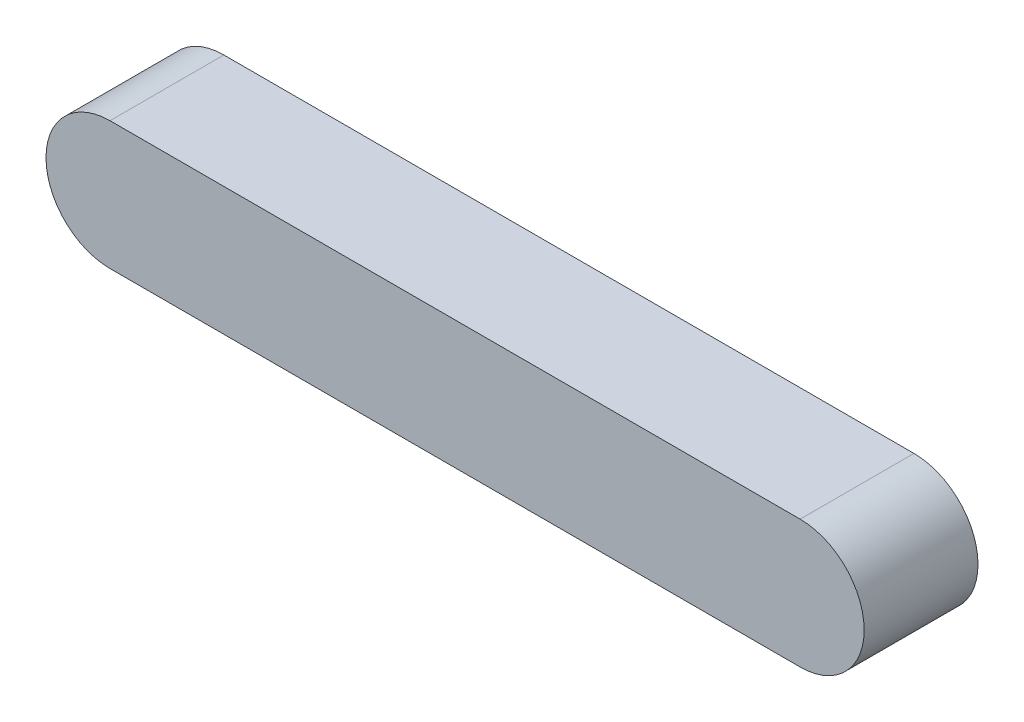
ISO-10303-21;
HEADER;
FILE_DESCRIPTION(('STEP AP214'),'2;1');
FILE_NAME('part.step','',(''),(''),'','','');
FILE_SCHEMA(('AUTOMOTIVE_DESIGN { 1 0 10303 214 1 1 1 1 }'));
ENDSEC;
DATA;
#1=APPLICATION_CONTEXT('core data for automotive mechanical design processes');
#2=APPLICATION_PROTOCOL_DEFINITION('international standard','automotive_design',2000,#1);
#3=PRODUCT_CONTEXT('',#1,'mechanical');
#4=PRODUCT('Part','Part','',(#3));
#5=PRODUCT_RELATED_PRODUCT_CATEGORY('part','',(#4));
#6=PRODUCT_DEFINITION_FORMATION('','',#4);
#7=PRODUCT_DEFINITION_CONTEXT('part definition',#1,'design');
#8=PRODUCT_DEFINITION('design','',#6,#7);
#9=PRODUCT_DEFINITION_SHAPE('','',#8);
#10=(LENGTH_UNIT() NAMED_UNIT(*) SI_UNIT(.MILLI.,.METRE.));
#11=(NAMED_UNIT(*) PLANE_ANGLE_UNIT() SI_UNIT($,.RADIAN.));
#12=(NAMED_UNIT(*) SI_UNIT($,.STERADIAN.) SOLID_ANGLE_UNIT());
#13=UNCERTAINTY_MEASURE_WITH_UNIT(LENGTH_MEASURE(1.E-05),#10,'distance_accuracy_value','');
#14=(GEOMETRIC_REPRESENTATION_CONTEXT(3) GLOBAL_UNCERTAINTY_ASSIGNED_CONTEXT((#13)) GLOBAL_UNIT_ASSIGNED_CONTEXT((#10,
#11,#12)) REPRESENTATION_CONTEXT('',''));
#15=CARTESIAN_POINT('',(0.,0.,0.));
#16=DIRECTION('',(0.,0.,1.));
#17=DIRECTION('',(1.,0.,0.));
#18=AXIS2_PLACEMENT_3D('',#15,#16,#17);
#19=CARTESIAN_POINT('',(-48.5,0.,16.));
#20=DIRECTION('',(0.,0.,-1.));
#21=DIRECTION('',(-1.,0.,0.));
#22=AXIS2_PLACEMENT_3D('',#19,#20,#21);
#23=CYLINDRICAL_SURFACE('',#22,8.99999999999996);
#24=CARTESIAN_POINT('',(-48.5,0.,0.));
#25=DIRECTION('',(0.,0.,1.));
#26=DIRECTION('',(1.,0.,0.));
#27=AXIS2_PLACEMENT_3D('',#24,#25,#26);
#28=CIRCLE('',#27,8.99999999999996);
#29=CARTESIAN_POINT('',(-48.5,8.99999999999996,0.));
#30=VERTEX_POINT('',#29);
#31=CARTESIAN_POINT('',(-48.5,-8.99999999999996,0.));
#32=VERTEX_POINT('',#31);
#33=EDGE_CURVE('E100',#30,#32,#28,.T.);
#34=ORIENTED_EDGE('',*,*,#33,.T.);
#35=DIRECTION('',(0.,0.,-1.));
#36=VECTOR('',#35,1.);
#37=CARTESIAN_POINT('',(-48.5,-8.99999999999996,16.));
#38=LINE('',#37,#36);
#39=CARTESIAN_POINT('',(-48.5,-8.99999999999996,16.));
#40=VERTEX_POINT('',#39);
#41=EDGE_CURVE('E11',#40,#32,#38,.T.);
#42=ORIENTED_EDGE('',*,*,#41,.F.);
#43=CARTESIAN_POINT('',(-48.5,0.,16.));
#44=DIRECTION('',(0.,0.,1.));
#45=DIRECTION('',(1.,0.,0.));
#46=AXIS2_PLACEMENT_3D('',#43,#44,#45);
#47=CIRCLE('',#46,8.99999999999996);
#48=CARTESIAN_POINT('',(-48.5,8.99999999999996,16.));
#49=VERTEX_POINT('',#48);
#50=EDGE_CURVE('E88',#49,#40,#47,.T.);
#51=ORIENTED_EDGE('',*,*,#50,.F.);
#52=DIRECTION('',(0.,0.,-1.));
#53=VECTOR('',#52,1.);
#54=CARTESIAN_POINT('',(-48.5,8.99999999999996,16.));
#55=LINE('',#54,#53);
#56=EDGE_CURVE('E96',#49,#30,#55,.T.);
#57=ORIENTED_EDGE('',*,*,#56,.T.);
#58=EDGE_LOOP('',(#34,#42,#51,#57));
#59=FACE_BOUND('',#58,.T.);
#60=ADVANCED_FACE('F37',(#59),#23,.T.);
#61=CARTESIAN_POINT('',(-48.5,-8.99999999999996,16.));
#62=DIRECTION('',(0.,1.,0.));
#63=DIRECTION('',(-1.,0.,0.));
#64=AXIS2_PLACEMENT_3D('',#61,#62,#63);
#65=PLANE('',#64);
#66=DIRECTION('',(1.,0.,0.));
#67=VECTOR('',#66,1.);
#68=CARTESIAN_POINT('',(-48.5,-8.99999999999996,0.));
#69=LINE('',#68,#67);
#70=CARTESIAN_POINT('',(48.5,-8.99999999999996,0.));
#71=VERTEX_POINT('',#70);
#72=EDGE_CURVE('E92',#32,#71,#69,.T.);
#73=ORIENTED_EDGE('',*,*,#72,.T.);
#74=DIRECTION('',(0.,0.,-1.));
#75=VECTOR('',#74,1.);
#76=CARTESIAN_POINT('',(48.5,-8.99999999999996,16.));
#77=LINE('',#76,#75);
#78=CARTESIAN_POINT('',(48.5,-8.99999999999996,16.));
#79=VERTEX_POINT('',#78);
#80=EDGE_CURVE('E45',#79,#71,#77,.T.);
#81=ORIENTED_EDGE('',*,*,#80,.F.);
#82=DIRECTION('',(1.,0.,0.));
#83=VECTOR('',#82,1.);
#84=CARTESIAN_POINT('',(-48.5,-8.99999999999996,16.));
#85=LINE('',#84,#83);
#86=EDGE_CURVE('E83',#40,#79,#85,.T.);
#87=ORIENTED_EDGE('',*,*,#86,.F.);
#88=ORIENTED_EDGE('',*,*,#41,.T.);
#89=EDGE_LOOP('',(#73,#81,#87,#88));
#90=FACE_BOUND('',#89,.T.);
#91=ADVANCED_FACE('F91',(#90),#65,.F.);
#92=CARTESIAN_POINT('',(48.5,0.,16.));
#93=DIRECTION('',(0.,0.,-1.));
#94=DIRECTION('',(-1.,0.,0.));
#95=AXIS2_PLACEMENT_3D('',#92,#93,#94);
#96=CYLINDRICAL_SURFACE('',#95,8.99999999999996);
#97=CARTESIAN_POINT('',(48.5,0.,0.));
#98=DIRECTION('',(0.,0.,1.));
#99=DIRECTION('',(1.,0.,0.));
#100=AXIS2_PLACEMENT_3D('',#97,#98,#99);
#101=CIRCLE('',#100,8.99999999999996);
#102=CARTESIAN_POINT('',(48.5,8.99999999999998,0.));
#103=VERTEX_POINT('',#102);
#104=EDGE_CURVE('E70',#71,#103,#101,.T.);
#105=ORIENTED_EDGE('',*,*,#104,.T.);
#106=DIRECTION('',(0.,0.,-1.));
#107=VECTOR('',#106,1.);
#108=CARTESIAN_POINT('',(48.5,8.99999999999998,16.));
#109=LINE('',#108,#107);
#110=CARTESIAN_POINT('',(48.5,8.99999999999998,16.));
#111=VERTEX_POINT('',#110);
#112=EDGE_CURVE('E93',#111,#103,#109,.T.);
#113=ORIENTED_EDGE('',*,*,#112,.F.);
#114=CARTESIAN_POINT('',(48.5,0.,16.));
#115=DIRECTION('',(0.,0.,1.));
#116=DIRECTION('',(1.,0.,0.));
#117=AXIS2_PLACEMENT_3D('',#114,#115,#116);
#118=CIRCLE('',#117,8.99999999999996);
#119=EDGE_CURVE('E86',#79,#111,#118,.T.);
#120=ORIENTED_EDGE('',*,*,#119,.F.);
#121=ORIENTED_EDGE('',*,*,#80,.T.);
#122=EDGE_LOOP('',(#105,#113,#120,#121));
#123=FACE_BOUND('',#122,.T.);
#124=ADVANCED_FACE('F94',(#123),#96,.T.);
#125=CARTESIAN_POINT('',(-48.5,8.99999999999996,16.));
#126=DIRECTION('',(0.,-1.,0.));
#127=DIRECTION('',(1.,0.,0.));
#128=AXIS2_PLACEMENT_3D('',#125,#126,#127);
#129=PLANE('',#128);
#130=DIRECTION('',(-1.,0.,0.));
#131=VECTOR('',#130,1.);
#132=CARTESIAN_POINT('',(-48.5,8.99999999999996,0.));
#133=LINE('',#132,#131);
#134=EDGE_CURVE('E76',#103,#30,#133,.T.);
#135=ORIENTED_EDGE('',*,*,#134,.T.);
#136=ORIENTED_EDGE('',*,*,#56,.F.);
#137=DIRECTION('',(-1.,0.,0.));
#138=VECTOR('',#137,1.);
#139=CARTESIAN_POINT('',(-48.5,8.99999999999996,16.));
#140=LINE('',#139,#138);
#141=EDGE_CURVE('E53',#111,#49,#140,.T.);
#142=ORIENTED_EDGE('',*,*,#141,.F.);
#143=ORIENTED_EDGE('',*,*,#112,.T.);
#144=EDGE_LOOP('',(#135,#136,#142,#143));
#145=FACE_BOUND('',#144,.T.);
#146=ADVANCED_FACE('F107',(#145),#129,.F.);
#147=CARTESIAN_POINT('',(-48.5,0.,16.));
#148=DIRECTION('',(0.,0.,1.));
#149=DIRECTION('',(1.,0.,0.));
#150=AXIS2_PLACEMENT_3D('',#147,#148,#149);
#151=PLANE('',#150);
#152=ORIENTED_EDGE('',*,*,#50,.T.);
#153=ORIENTED_EDGE('',*,*,#86,.T.);
#154=ORIENTED_EDGE('',*,*,#119,.T.);
#155=ORIENTED_EDGE('',*,*,#141,.T.);
#156=EDGE_LOOP('',(#152,#153,#154,#155));
#157=FACE_BOUND('',#156,.T.);
#158=ADVANCED_FACE('F84',(#157),#151,.T.);
#159=CARTESIAN_POINT('',(-48.5,0.,0.));
#160=DIRECTION('',(0.,0.,1.));
#161=DIRECTION('',(1.,0.,0.));
#162=AXIS2_PLACEMENT_3D('',#159,#160,#161);
#163=PLANE('',#162);
#164=ORIENTED_EDGE('',*,*,#33,.F.);
#165=ORIENTED_EDGE('',*,*,#134,.F.);
#166=ORIENTED_EDGE('',*,*,#104,.F.);
#167=ORIENTED_EDGE('',*,*,#72,.F.);
#168=EDGE_LOOP('',(#164,#165,#166,#167));
#169=FACE_BOUND('',#168,.T.);
#170=ADVANCED_FACE('F110',(#169),#163,.F.);
#171=CLOSED_SHELL('',(#60,#91,#124,#146,#158,#170));
#172=MANIFOLD_SOLID_BREP('B2',#171);
#173=ADVANCED_BREP_SHAPE_REPRESENTATION('',(#18,#172),#14);
#174=SHAPE_DEFINITION_REPRESENTATION(#9,#173);
ENDSEC;
END-ISO-10303-21;
